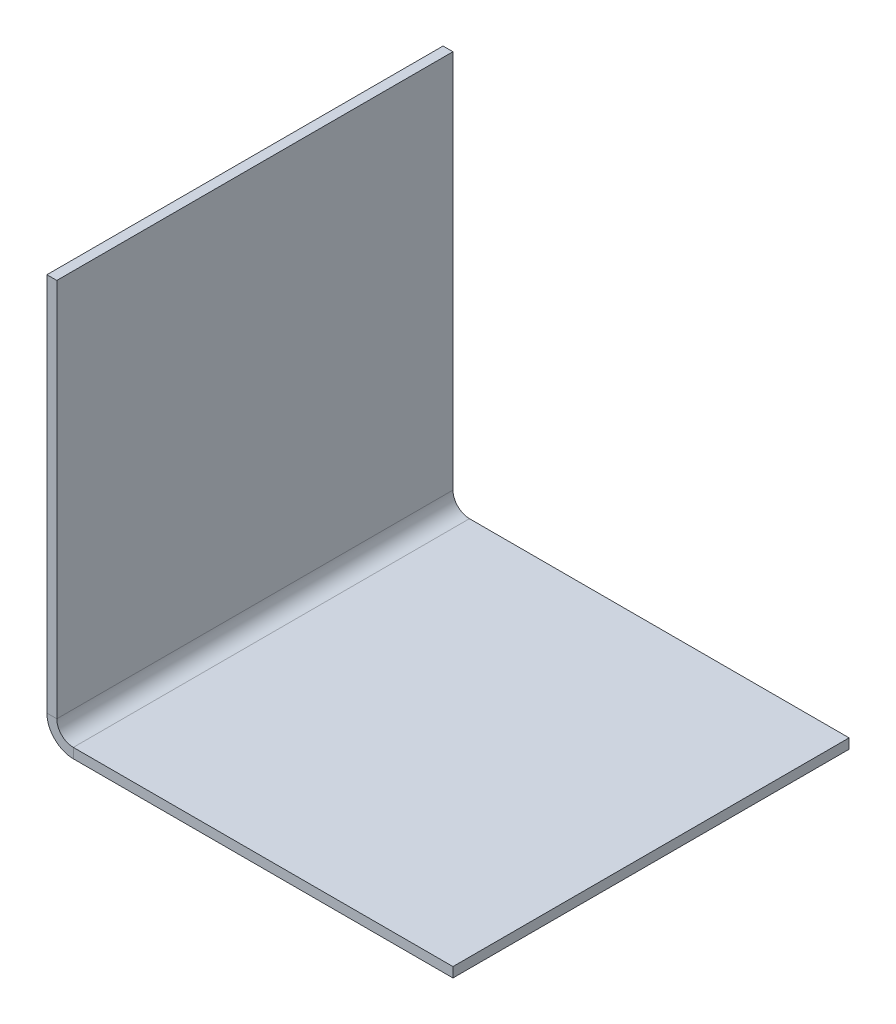
ISO-10303-21;
HEADER;
FILE_DESCRIPTION(('STEP AP214'),'2;1');
FILE_NAME('part.step','',(''),(''),'','','');
FILE_SCHEMA(('AUTOMOTIVE_DESIGN { 1 0 10303 214 1 1 1 1 }'));
ENDSEC;
DATA;
#1=APPLICATION_CONTEXT('core data for automotive mechanical design processes');
#2=APPLICATION_PROTOCOL_DEFINITION('international standard','automotive_design',2000,#1);
#3=PRODUCT_CONTEXT('',#1,'mechanical');
#4=PRODUCT('Part','Part','',(#3));
#5=PRODUCT_RELATED_PRODUCT_CATEGORY('part','',(#4));
#6=PRODUCT_DEFINITION_FORMATION('','',#4);
#7=PRODUCT_DEFINITION_CONTEXT('part definition',#1,'design');
#8=PRODUCT_DEFINITION('design','',#6,#7);
#9=PRODUCT_DEFINITION_SHAPE('','',#8);
#10=(LENGTH_UNIT() NAMED_UNIT(*) SI_UNIT(.MILLI.,.METRE.));
#11=(NAMED_UNIT(*) PLANE_ANGLE_UNIT() SI_UNIT($,.RADIAN.));
#12=(NAMED_UNIT(*) SI_UNIT($,.STERADIAN.) SOLID_ANGLE_UNIT());
#13=UNCERTAINTY_MEASURE_WITH_UNIT(LENGTH_MEASURE(1.E-05),#10,'distance_accuracy_value','');
#14=(GEOMETRIC_REPRESENTATION_CONTEXT(3) GLOBAL_UNCERTAINTY_ASSIGNED_CONTEXT((#13)) GLOBAL_UNIT_ASSIGNED_CONTEXT((#10,
#11,#12)) REPRESENTATION_CONTEXT('',''));
#15=CARTESIAN_POINT('',(0.,0.,0.));
#16=DIRECTION('',(0.,0.,1.));
#17=DIRECTION('',(1.,0.,0.));
#18=AXIS2_PLACEMENT_3D('',#15,#16,#17);
#19=CARTESIAN_POINT('',(-60.,3.,60.));
#20=DIRECTION('',(0.,0.,1.));
#21=DIRECTION('',(1.,0.,0.));
#22=AXIS2_PLACEMENT_3D('',#19,#20,#21);
#23=PLANE('',#22);
#24=DIRECTION('',(0.,1.,0.));
#25=VECTOR('',#24,1.);
#26=CARTESIAN_POINT('',(-55.,3.,60.));
#27=LINE('',#26,#25);
#28=CARTESIAN_POINT('',(-55.,0.,60.));
#29=VERTEX_POINT('',#28);
#30=CARTESIAN_POINT('',(-55.,3.,60.));
#31=VERTEX_POINT('',#30);
#32=EDGE_CURVE('E11',#29,#31,#27,.T.);
#33=ORIENTED_EDGE('',*,*,#32,.F.);
#34=DIRECTION('',(1.,0.,0.));
#35=VECTOR('',#34,1.);
#36=CARTESIAN_POINT('',(0.,0.,60.));
#37=LINE('',#36,#35);
#38=CARTESIAN_POINT('',(60.,0.,60.));
#39=VERTEX_POINT('',#38);
#40=EDGE_CURVE('E86',#29,#39,#37,.T.);
#41=ORIENTED_EDGE('',*,*,#40,.T.);
#42=DIRECTION('',(0.,1.,0.));
#43=VECTOR('',#42,1.);
#44=CARTESIAN_POINT('',(60.,3.,60.));
#45=LINE('',#44,#43);
#46=CARTESIAN_POINT('',(60.,3.,60.));
#47=VERTEX_POINT('',#46);
#48=EDGE_CURVE('E47',#39,#47,#45,.T.);
#49=ORIENTED_EDGE('',*,*,#48,.T.);
#50=DIRECTION('',(1.,0.,0.));
#51=VECTOR('',#50,1.);
#52=CARTESIAN_POINT('',(-60.,3.,60.));
#53=LINE('',#52,#51);
#54=EDGE_CURVE('E88',#31,#47,#53,.T.);
#55=ORIENTED_EDGE('',*,*,#54,.F.);
#56=EDGE_LOOP('',(#33,#41,#49,#55));
#57=FACE_BOUND('',#56,.T.);
#58=ADVANCED_FACE('F37',(#57),#23,.T.);
#59=CARTESIAN_POINT('',(60.,3.,-60.));
#60=DIRECTION('',(1.,0.,0.));
#61=DIRECTION('',(0.,0.,-1.));
#62=AXIS2_PLACEMENT_3D('',#59,#60,#61);
#63=PLANE('',#62);
#64=ORIENTED_EDGE('',*,*,#48,.F.);
#65=DIRECTION('',(0.,0.,1.));
#66=VECTOR('',#65,1.);
#67=CARTESIAN_POINT('',(60.,0.,0.));
#68=LINE('',#67,#66);
#69=CARTESIAN_POINT('',(60.,0.,-60.));
#70=VERTEX_POINT('',#69);
#71=EDGE_CURVE('E112',#39,#70,#68,.F.);
#72=ORIENTED_EDGE('',*,*,#71,.T.);
#73=DIRECTION('',(0.,1.,0.));
#74=VECTOR('',#73,1.);
#75=CARTESIAN_POINT('',(60.,3.,-60.));
#76=LINE('',#75,#74);
#77=CARTESIAN_POINT('',(60.,3.,-60.));
#78=VERTEX_POINT('',#77);
#79=EDGE_CURVE('E132',#70,#78,#76,.T.);
#80=ORIENTED_EDGE('',*,*,#79,.T.);
#81=DIRECTION('',(0.,0.,-1.));
#82=VECTOR('',#81,1.);
#83=CARTESIAN_POINT('',(60.,3.,-60.));
#84=LINE('',#83,#82);
#85=EDGE_CURVE('E145',#47,#78,#84,.T.);
#86=ORIENTED_EDGE('',*,*,#85,.F.);
#87=EDGE_LOOP('',(#64,#72,#80,#86));
#88=FACE_BOUND('',#87,.T.);
#89=ADVANCED_FACE('F152',(#88),#63,.T.);
#90=CARTESIAN_POINT('',(-60.,3.,-60.));
#91=DIRECTION('',(0.,0.,-1.));
#92=DIRECTION('',(-1.,0.,0.));
#93=AXIS2_PLACEMENT_3D('',#90,#91,#92);
#94=PLANE('',#93);
#95=ORIENTED_EDGE('',*,*,#79,.F.);
#96=DIRECTION('',(1.,0.,0.));
#97=VECTOR('',#96,1.);
#98=CARTESIAN_POINT('',(0.,0.,-60.));
#99=LINE('',#98,#97);
#100=CARTESIAN_POINT('',(-55.,0.,-60.));
#101=VERTEX_POINT('',#100);
#102=EDGE_CURVE('E114',#70,#101,#99,.F.);
#103=ORIENTED_EDGE('',*,*,#102,.T.);
#104=DIRECTION('',(0.,1.,0.));
#105=VECTOR('',#104,1.);
#106=CARTESIAN_POINT('',(-55.,3.,-60.));
#107=LINE('',#106,#105);
#108=CARTESIAN_POINT('',(-55.,3.,-60.));
#109=VERTEX_POINT('',#108);
#110=EDGE_CURVE('E129',#101,#109,#107,.T.);
#111=ORIENTED_EDGE('',*,*,#110,.T.);
#112=DIRECTION('',(-1.,0.,0.));
#113=VECTOR('',#112,1.);
#114=CARTESIAN_POINT('',(-60.,3.,-60.));
#115=LINE('',#114,#113);
#116=EDGE_CURVE('E150',#78,#109,#115,.T.);
#117=ORIENTED_EDGE('',*,*,#116,.F.);
#118=EDGE_LOOP('',(#95,#103,#111,#117));
#119=FACE_BOUND('',#118,.T.);
#120=ADVANCED_FACE('F181',(#119),#94,.T.);
#121=CARTESIAN_POINT('',(-55.,8.,-60.));
#122=DIRECTION('',(0.,0.,1.));
#123=DIRECTION('',(1.,0.,0.));
#124=AXIS2_PLACEMENT_3D('',#121,#122,#123);
#125=PLANE('',#124);
#126=ORIENTED_EDGE('',*,*,#110,.F.);
#127=CARTESIAN_POINT('',(-55.,8.,-60.));
#128=DIRECTION('',(0.,0.,-1.));
#129=DIRECTION('',(-1.,0.,0.));
#130=AXIS2_PLACEMENT_3D('',#127,#128,#129);
#131=CIRCLE('',#130,8.);
#132=CARTESIAN_POINT('',(-63.,8.00000000000001,-60.));
#133=VERTEX_POINT('',#132);
#134=EDGE_CURVE('E102',#101,#133,#131,.T.);
#135=ORIENTED_EDGE('',*,*,#134,.T.);
#136=DIRECTION('',(1.,0.,0.));
#137=VECTOR('',#136,1.);
#138=CARTESIAN_POINT('',(-60.,8.00000000000001,-60.));
#139=LINE('',#138,#137);
#140=CARTESIAN_POINT('',(-60.,8.00000000000001,-60.));
#141=VERTEX_POINT('',#140);
#142=EDGE_CURVE('E127',#133,#141,#139,.T.);
#143=ORIENTED_EDGE('',*,*,#142,.T.);
#144=CARTESIAN_POINT('',(-55.,8.,-60.));
#145=DIRECTION('',(0.,0.,-1.));
#146=DIRECTION('',(-1.,0.,0.));
#147=AXIS2_PLACEMENT_3D('',#144,#145,#146);
#148=CIRCLE('',#147,5.);
#149=EDGE_CURVE('E153',#109,#141,#148,.T.);
#150=ORIENTED_EDGE('',*,*,#149,.F.);
#151=EDGE_LOOP('',(#126,#135,#143,#150));
#152=FACE_BOUND('',#151,.T.);
#153=ADVANCED_FACE('F188',(#152),#125,.F.);
#154=CARTESIAN_POINT('',(-60.,123.,-60.));
#155=DIRECTION('',(0.,0.,1.));
#156=DIRECTION('',(0.,-1.,0.));
#157=AXIS2_PLACEMENT_3D('',#154,#155,#156);
#158=PLANE('',#157);
#159=ORIENTED_EDGE('',*,*,#142,.F.);
#160=DIRECTION('',(0.,1.,0.));
#161=VECTOR('',#160,1.);
#162=CARTESIAN_POINT('',(-63.,123.,-60.));
#163=LINE('',#162,#161);
#164=CARTESIAN_POINT('',(-63.,123.,-60.));
#165=VERTEX_POINT('',#164);
#166=EDGE_CURVE('E113',#165,#133,#163,.F.);
#167=ORIENTED_EDGE('',*,*,#166,.F.);
#168=DIRECTION('',(1.,0.,0.));
#169=VECTOR('',#168,1.);
#170=CARTESIAN_POINT('',(-60.,123.,-60.));
#171=LINE('',#170,#169);
#172=CARTESIAN_POINT('',(-60.,123.,-60.));
#173=VERTEX_POINT('',#172);
#174=EDGE_CURVE('E124',#165,#173,#171,.T.);
#175=ORIENTED_EDGE('',*,*,#174,.T.);
#176=DIRECTION('',(0.,-1.,0.));
#177=VECTOR('',#176,1.);
#178=CARTESIAN_POINT('',(-60.,123.,-60.));
#179=LINE('',#178,#177);
#180=EDGE_CURVE('E149',#173,#141,#179,.T.);
#181=ORIENTED_EDGE('',*,*,#180,.T.);
#182=EDGE_LOOP('',(#159,#167,#175,#181));
#183=FACE_BOUND('',#182,.T.);
#184=ADVANCED_FACE('F202',(#183),#158,.F.);
#185=CARTESIAN_POINT('',(-60.,123.,60.));
#186=DIRECTION('',(0.,1.,0.));
#187=DIRECTION('',(0.,0.,1.));
#188=AXIS2_PLACEMENT_3D('',#185,#186,#187);
#189=PLANE('',#188);
#190=ORIENTED_EDGE('',*,*,#174,.F.);
#191=DIRECTION('',(0.,0.,-1.));
#192=VECTOR('',#191,1.);
#193=CARTESIAN_POINT('',(-63.,123.,60.));
#194=LINE('',#193,#192);
#195=CARTESIAN_POINT('',(-63.,123.,60.));
#196=VERTEX_POINT('',#195);
#197=EDGE_CURVE('E175',#165,#196,#194,.F.);
#198=ORIENTED_EDGE('',*,*,#197,.T.);
#199=DIRECTION('',(1.,0.,0.));
#200=VECTOR('',#199,1.);
#201=CARTESIAN_POINT('',(-60.,123.,60.));
#202=LINE('',#201,#200);
#203=CARTESIAN_POINT('',(-60.,123.,60.));
#204=VERTEX_POINT('',#203);
#205=EDGE_CURVE('E121',#196,#204,#202,.T.);
#206=ORIENTED_EDGE('',*,*,#205,.T.);
#207=DIRECTION('',(0.,0.,1.));
#208=VECTOR('',#207,1.);
#209=CARTESIAN_POINT('',(-60.,123.,60.));
#210=LINE('',#209,#208);
#211=EDGE_CURVE('E162',#173,#204,#210,.T.);
#212=ORIENTED_EDGE('',*,*,#211,.F.);
#213=EDGE_LOOP('',(#190,#198,#206,#212));
#214=FACE_BOUND('',#213,.T.);
#215=ADVANCED_FACE('F204',(#214),#189,.T.);
#216=CARTESIAN_POINT('',(-60.,123.,60.));
#217=DIRECTION('',(0.,0.,1.));
#218=DIRECTION('',(0.,-1.,0.));
#219=AXIS2_PLACEMENT_3D('',#216,#217,#218);
#220=PLANE('',#219);
#221=ORIENTED_EDGE('',*,*,#205,.F.);
#222=DIRECTION('',(0.,1.,0.));
#223=VECTOR('',#222,1.);
#224=CARTESIAN_POINT('',(-63.,123.,60.));
#225=LINE('',#224,#223);
#226=CARTESIAN_POINT('',(-63.,8.00000000000001,60.));
#227=VERTEX_POINT('',#226);
#228=EDGE_CURVE('E107',#196,#227,#225,.F.);
#229=ORIENTED_EDGE('',*,*,#228,.T.);
#230=DIRECTION('',(1.,0.,0.));
#231=VECTOR('',#230,1.);
#232=CARTESIAN_POINT('',(-60.,8.00000000000001,60.));
#233=LINE('',#232,#231);
#234=CARTESIAN_POINT('',(-60.,8.00000000000001,60.));
#235=VERTEX_POINT('',#234);
#236=EDGE_CURVE('E41',#227,#235,#233,.T.);
#237=ORIENTED_EDGE('',*,*,#236,.T.);
#238=DIRECTION('',(0.,-1.,0.));
#239=VECTOR('',#238,1.);
#240=CARTESIAN_POINT('',(-60.,123.,60.));
#241=LINE('',#240,#239);
#242=EDGE_CURVE('E165',#204,#235,#241,.T.);
#243=ORIENTED_EDGE('',*,*,#242,.F.);
#244=EDGE_LOOP('',(#221,#229,#237,#243));
#245=FACE_BOUND('',#244,.T.);
#246=ADVANCED_FACE('F196',(#245),#220,.T.);
#247=CARTESIAN_POINT('',(-55.,8.,60.));
#248=DIRECTION('',(0.,0.,1.));
#249=DIRECTION('',(1.,0.,0.));
#250=AXIS2_PLACEMENT_3D('',#247,#248,#249);
#251=PLANE('',#250);
#252=CARTESIAN_POINT('',(-55.,8.,60.));
#253=DIRECTION('',(0.,0.,-1.));
#254=DIRECTION('',(-1.,0.,0.));
#255=AXIS2_PLACEMENT_3D('',#252,#253,#254);
#256=CIRCLE('',#255,8.);
#257=EDGE_CURVE('E100',#227,#29,#256,.F.);
#258=ORIENTED_EDGE('',*,*,#257,.T.);
#259=ORIENTED_EDGE('',*,*,#32,.T.);
#260=CARTESIAN_POINT('',(-55.,8.,60.));
#261=DIRECTION('',(0.,0.,-1.));
#262=DIRECTION('',(-1.,0.,0.));
#263=AXIS2_PLACEMENT_3D('',#260,#261,#262);
#264=CIRCLE('',#263,5.);
#265=EDGE_CURVE('E157',#235,#31,#264,.F.);
#266=ORIENTED_EDGE('',*,*,#265,.F.);
#267=ORIENTED_EDGE('',*,*,#236,.F.);
#268=EDGE_LOOP('',(#258,#259,#266,#267));
#269=FACE_BOUND('',#268,.T.);
#270=ADVANCED_FACE('F39',(#269),#251,.T.);
#271=CARTESIAN_POINT('',(-60.,123.,60.));
#272=DIRECTION('',(1.,0.,0.));
#273=DIRECTION('',(0.,0.,-1.));
#274=AXIS2_PLACEMENT_3D('',#271,#272,#273);
#275=PLANE('',#274);
#276=ORIENTED_EDGE('',*,*,#242,.T.);
#277=DIRECTION('',(0.,0.,1.));
#278=VECTOR('',#277,1.);
#279=CARTESIAN_POINT('',(-60.,8.,-60.));
#280=LINE('',#279,#278);
#281=EDGE_CURVE('E169',#235,#141,#280,.F.);
#282=ORIENTED_EDGE('',*,*,#281,.T.);
#283=ORIENTED_EDGE('',*,*,#180,.F.);
#284=ORIENTED_EDGE('',*,*,#211,.T.);
#285=EDGE_LOOP('',(#276,#282,#283,#284));
#286=FACE_BOUND('',#285,.T.);
#287=ADVANCED_FACE('F193',(#286),#275,.T.);
#288=CARTESIAN_POINT('',(0.,3.,0.));
#289=DIRECTION('',(0.,1.,0.));
#290=DIRECTION('',(0.,0.,1.));
#291=AXIS2_PLACEMENT_3D('',#288,#289,#290);
#292=PLANE('',#291);
#293=ORIENTED_EDGE('',*,*,#116,.T.);
#294=DIRECTION('',(0.,0.,1.));
#295=VECTOR('',#294,1.);
#296=CARTESIAN_POINT('',(-55.,3.,60.));
#297=LINE('',#296,#295);
#298=EDGE_CURVE('E148',#109,#31,#297,.T.);
#299=ORIENTED_EDGE('',*,*,#298,.T.);
#300=ORIENTED_EDGE('',*,*,#54,.T.);
#301=ORIENTED_EDGE('',*,*,#85,.T.);
#302=EDGE_LOOP('',(#293,#299,#300,#301));
#303=FACE_BOUND('',#302,.T.);
#304=ADVANCED_FACE('F144',(#303),#292,.T.);
#305=CARTESIAN_POINT('',(-55.,8.,0.));
#306=DIRECTION('',(0.,0.,-1.));
#307=DIRECTION('',(-1.,0.,0.));
#308=AXIS2_PLACEMENT_3D('',#305,#306,#307);
#309=CYLINDRICAL_SURFACE('',#308,5.);
#310=ORIENTED_EDGE('',*,*,#149,.T.);
#311=ORIENTED_EDGE('',*,*,#281,.F.);
#312=ORIENTED_EDGE('',*,*,#265,.T.);
#313=ORIENTED_EDGE('',*,*,#298,.F.);
#314=EDGE_LOOP('',(#310,#311,#312,#313));
#315=FACE_BOUND('',#314,.T.);
#316=ADVANCED_FACE('F191',(#315),#309,.F.);
#317=CARTESIAN_POINT('',(-63.,123.,60.));
#318=DIRECTION('',(1.,0.,0.));
#319=DIRECTION('',(0.,0.,-1.));
#320=AXIS2_PLACEMENT_3D('',#317,#318,#319);
#321=PLANE('',#320);
#322=ORIENTED_EDGE('',*,*,#228,.F.);
#323=ORIENTED_EDGE('',*,*,#197,.F.);
#324=ORIENTED_EDGE('',*,*,#166,.T.);
#325=DIRECTION('',(0.,0.,-1.));
#326=VECTOR('',#325,1.);
#327=CARTESIAN_POINT('',(-63.,8.00000000000001,60.));
#328=LINE('',#327,#326);
#329=EDGE_CURVE('E106',#227,#133,#328,.T.);
#330=ORIENTED_EDGE('',*,*,#329,.F.);
#331=EDGE_LOOP('',(#322,#323,#324,#330));
#332=FACE_BOUND('',#331,.T.);
#333=ADVANCED_FACE('F278',(#332),#321,.F.);
#334=CARTESIAN_POINT('',(0.,0.,0.));
#335=DIRECTION('',(0.,1.,0.));
#336=DIRECTION('',(0.,0.,1.));
#337=AXIS2_PLACEMENT_3D('',#334,#335,#336);
#338=PLANE('',#337);
#339=ORIENTED_EDGE('',*,*,#102,.F.);
#340=ORIENTED_EDGE('',*,*,#71,.F.);
#341=ORIENTED_EDGE('',*,*,#40,.F.);
#342=DIRECTION('',(0.,0.,1.));
#343=VECTOR('',#342,1.);
#344=CARTESIAN_POINT('',(-55.,0.,0.));
#345=LINE('',#344,#343);
#346=EDGE_CURVE('E97',#101,#29,#345,.T.);
#347=ORIENTED_EDGE('',*,*,#346,.F.);
#348=EDGE_LOOP('',(#339,#340,#341,#347));
#349=FACE_BOUND('',#348,.T.);
#350=ADVANCED_FACE('F110',(#349),#338,.F.);
#351=CARTESIAN_POINT('',(-55.,8.,0.));
#352=DIRECTION('',(0.,0.,-1.));
#353=DIRECTION('',(-1.,0.,0.));
#354=AXIS2_PLACEMENT_3D('',#351,#352,#353);
#355=CYLINDRICAL_SURFACE('',#354,8.);
#356=ORIENTED_EDGE('',*,*,#134,.F.);
#357=ORIENTED_EDGE('',*,*,#346,.T.);
#358=ORIENTED_EDGE('',*,*,#257,.F.);
#359=ORIENTED_EDGE('',*,*,#329,.T.);
#360=EDGE_LOOP('',(#356,#357,#358,#359));
#361=FACE_BOUND('',#360,.T.);
#362=ADVANCED_FACE('F98',(#361),#355,.T.);
#363=CLOSED_SHELL('',(#58,#89,#120,#153,#184,#215,#246,#270,#287,#304,#316,#333,#350,#362));
#364=MANIFOLD_SOLID_BREP('B2',#363);
#365=ADVANCED_BREP_SHAPE_REPRESENTATION('',(#18,#364),#14);
#366=SHAPE_DEFINITION_REPRESENTATION(#9,#365);
ENDSEC;
END-ISO-10303-21;
